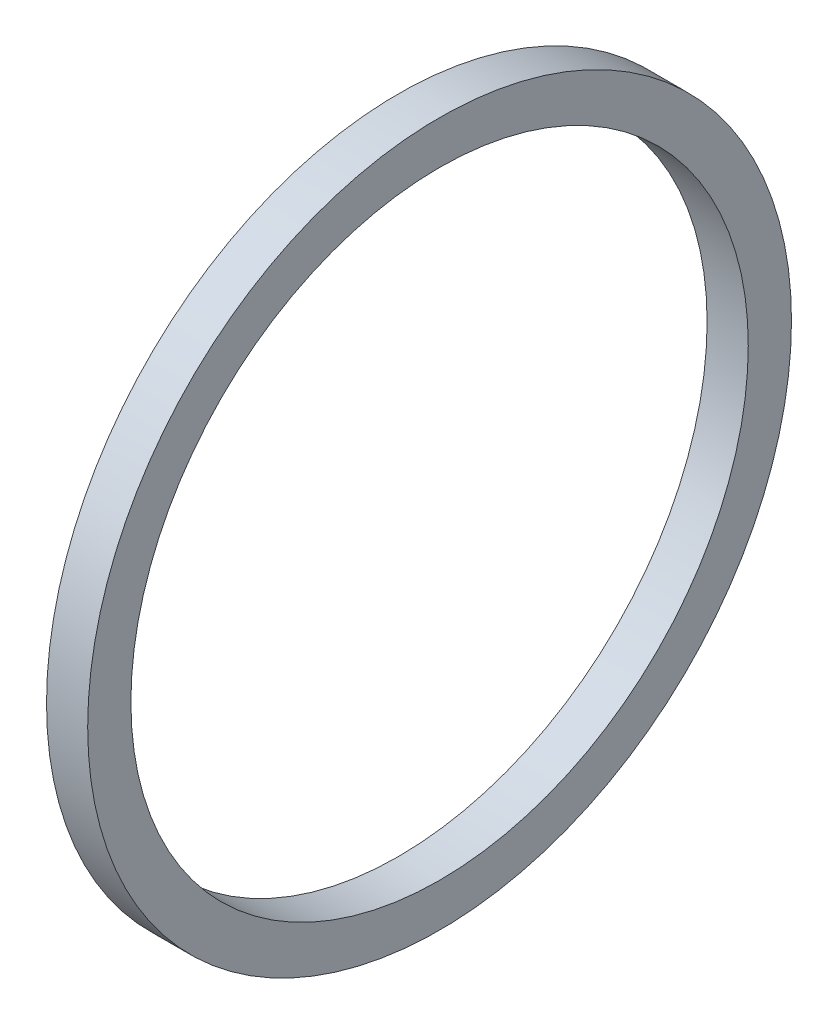
ISO-10303-21;
HEADER;
FILE_DESCRIPTION(('STEP AP214'),'2;1');
FILE_NAME('part.step','',(''),(''),'','','');
FILE_SCHEMA(('AUTOMOTIVE_DESIGN { 1 0 10303 214 1 1 1 1 }'));
ENDSEC;
DATA;
#1=APPLICATION_CONTEXT('core data for automotive mechanical design processes');
#2=APPLICATION_PROTOCOL_DEFINITION('international standard','automotive_design',2000,#1);
#3=PRODUCT_CONTEXT('',#1,'mechanical');
#4=PRODUCT('Part','Part','',(#3));
#5=PRODUCT_RELATED_PRODUCT_CATEGORY('part','',(#4));
#6=PRODUCT_DEFINITION_FORMATION('','',#4);
#7=PRODUCT_DEFINITION_CONTEXT('part definition',#1,'design');
#8=PRODUCT_DEFINITION('design','',#6,#7);
#9=PRODUCT_DEFINITION_SHAPE('','',#8);
#10=(LENGTH_UNIT() NAMED_UNIT(*) SI_UNIT(.MILLI.,.METRE.));
#11=(NAMED_UNIT(*) PLANE_ANGLE_UNIT() SI_UNIT($,.RADIAN.));
#12=(NAMED_UNIT(*) SI_UNIT($,.STERADIAN.) SOLID_ANGLE_UNIT());
#13=UNCERTAINTY_MEASURE_WITH_UNIT(LENGTH_MEASURE(1.E-05),#10,'distance_accuracy_value','');
#14=(GEOMETRIC_REPRESENTATION_CONTEXT(3) GLOBAL_UNCERTAINTY_ASSIGNED_CONTEXT((#13)) GLOBAL_UNIT_ASSIGNED_CONTEXT((#10,
#11,#12)) REPRESENTATION_CONTEXT('',''));
#15=CARTESIAN_POINT('',(0.,0.,0.));
#16=DIRECTION('',(0.,0.,1.));
#17=DIRECTION('',(1.,0.,0.));
#18=AXIS2_PLACEMENT_3D('',#15,#16,#17);
#19=CARTESIAN_POINT('',(0.,0.,0.));
#20=DIRECTION('',(1.,0.,0.));
#21=DIRECTION('',(0.,0.,-1.));
#22=AXIS2_PLACEMENT_3D('',#19,#20,#21);
#23=PLANE('',#22);
#24=CARTESIAN_POINT('',(0.,0.,0.));
#25=DIRECTION('',(-1.,0.,0.));
#26=DIRECTION('',(0.,0.,1.));
#27=AXIS2_PLACEMENT_3D('',#24,#25,#26);
#28=CIRCLE('',#27,15.);
#29=CARTESIAN_POINT('',(0.,0.,15.));
#30=VERTEX_POINT('',#29);
#31=EDGE_CURVE('E27',#30,#30,#28,.F.);
#32=ORIENTED_EDGE('',*,*,#31,.T.);
#33=EDGE_LOOP('',(#32));
#34=FACE_BOUND('',#33,.T.);
#35=CARTESIAN_POINT('',(0.,0.,0.));
#36=DIRECTION('',(-1.,0.,0.));
#37=DIRECTION('',(0.,0.,1.));
#38=AXIS2_PLACEMENT_3D('',#35,#36,#37);
#39=CIRCLE('',#38,17.1);
#40=CARTESIAN_POINT('',(0.,0.,17.1));
#41=VERTEX_POINT('',#40);
#42=EDGE_CURVE('E18',#41,#41,#39,.F.);
#43=ORIENTED_EDGE('',*,*,#42,.F.);
#44=EDGE_LOOP('',(#43));
#45=FACE_BOUND('',#44,.T.);
#46=ADVANCED_FACE('F15',(#34,#45),#23,.F.);
#47=CARTESIAN_POINT('',(2.,0.,0.));
#48=DIRECTION('',(-1.,0.,0.));
#49=DIRECTION('',(0.,0.,1.));
#50=AXIS2_PLACEMENT_3D('',#47,#48,#49);
#51=CYLINDRICAL_SURFACE('',#50,17.1);
#52=ORIENTED_EDGE('',*,*,#42,.T.);
#53=EDGE_LOOP('',(#52));
#54=FACE_BOUND('',#53,.T.);
#55=CARTESIAN_POINT('',(2.,0.,0.));
#56=DIRECTION('',(-1.,0.,0.));
#57=DIRECTION('',(0.,0.,1.));
#58=AXIS2_PLACEMENT_3D('',#55,#56,#57);
#59=CIRCLE('',#58,17.1);
#60=CARTESIAN_POINT('',(2.,0.,17.1));
#61=VERTEX_POINT('',#60);
#62=EDGE_CURVE('E22',#61,#61,#59,.F.);
#63=ORIENTED_EDGE('',*,*,#62,.F.);
#64=EDGE_LOOP('',(#63));
#65=FACE_BOUND('',#64,.T.);
#66=ADVANCED_FACE('F35',(#54,#65),#51,.T.);
#67=CARTESIAN_POINT('',(2.,0.,0.));
#68=DIRECTION('',(-1.,0.,0.));
#69=DIRECTION('',(0.,0.,1.));
#70=AXIS2_PLACEMENT_3D('',#67,#68,#69);
#71=CYLINDRICAL_SURFACE('',#70,15.);
#72=CARTESIAN_POINT('',(2.,0.,0.));
#73=DIRECTION('',(-1.,0.,0.));
#74=DIRECTION('',(0.,0.,1.));
#75=AXIS2_PLACEMENT_3D('',#72,#73,#74);
#76=CIRCLE('',#75,15.);
#77=CARTESIAN_POINT('',(2.,0.,15.));
#78=VERTEX_POINT('',#77);
#79=EDGE_CURVE('E10',#78,#78,#76,.T.);
#80=ORIENTED_EDGE('',*,*,#79,.F.);
#81=EDGE_LOOP('',(#80));
#82=FACE_BOUND('',#81,.T.);
#83=ORIENTED_EDGE('',*,*,#31,.F.);
#84=EDGE_LOOP('',(#83));
#85=FACE_BOUND('',#84,.T.);
#86=ADVANCED_FACE('F43',(#82,#85),#71,.F.);
#87=CARTESIAN_POINT('',(2.,0.,0.));
#88=DIRECTION('',(1.,0.,0.));
#89=DIRECTION('',(0.,0.,-1.));
#90=AXIS2_PLACEMENT_3D('',#87,#88,#89);
#91=PLANE('',#90);
#92=ORIENTED_EDGE('',*,*,#79,.T.);
#93=EDGE_LOOP('',(#92));
#94=FACE_BOUND('',#93,.T.);
#95=ORIENTED_EDGE('',*,*,#62,.T.);
#96=EDGE_LOOP('',(#95));
#97=FACE_BOUND('',#96,.T.);
#98=ADVANCED_FACE('F44',(#94,#97),#91,.T.);
#99=CLOSED_SHELL('',(#46,#66,#86,#98));
#100=MANIFOLD_SOLID_BREP('B1',#99);
#101=ADVANCED_BREP_SHAPE_REPRESENTATION('',(#18,#100),#14);
#102=SHAPE_DEFINITION_REPRESENTATION(#9,#101);
ENDSEC;
END-ISO-10303-21;
